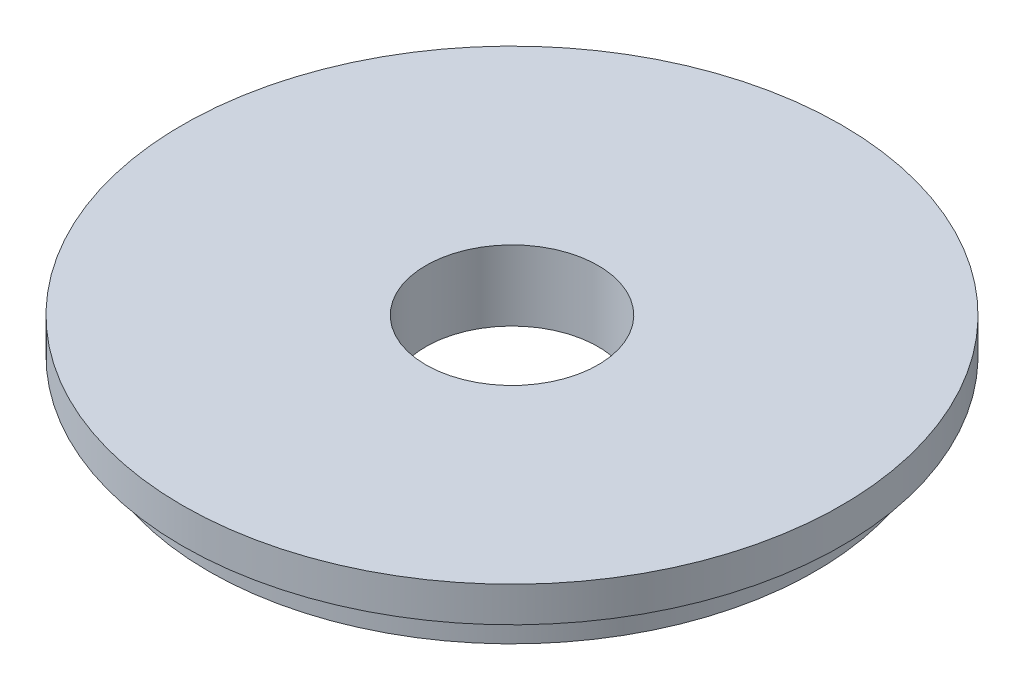
ISO-10303-21;
HEADER;
FILE_DESCRIPTION(('STEP AP214'),'2;1');
FILE_NAME('part.step','',(''),(''),'','','');
FILE_SCHEMA(('AUTOMOTIVE_DESIGN { 1 0 10303 214 1 1 1 1 }'));
ENDSEC;
DATA;
#1=APPLICATION_CONTEXT('core data for automotive mechanical design processes');
#2=APPLICATION_PROTOCOL_DEFINITION('international standard','automotive_design',2000,#1);
#3=PRODUCT_CONTEXT('',#1,'mechanical');
#4=PRODUCT('Part','Part','',(#3));
#5=PRODUCT_RELATED_PRODUCT_CATEGORY('part','',(#4));
#6=PRODUCT_DEFINITION_FORMATION('','',#4);
#7=PRODUCT_DEFINITION_CONTEXT('part definition',#1,'design');
#8=PRODUCT_DEFINITION('design','',#6,#7);
#9=PRODUCT_DEFINITION_SHAPE('','',#8);
#10=(LENGTH_UNIT() NAMED_UNIT(*) SI_UNIT(.MILLI.,.METRE.));
#11=(NAMED_UNIT(*) PLANE_ANGLE_UNIT() SI_UNIT($,.RADIAN.));
#12=(NAMED_UNIT(*) SI_UNIT($,.STERADIAN.) SOLID_ANGLE_UNIT());
#13=UNCERTAINTY_MEASURE_WITH_UNIT(LENGTH_MEASURE(1.E-05),#10,'distance_accuracy_value','');
#14=(GEOMETRIC_REPRESENTATION_CONTEXT(3) GLOBAL_UNCERTAINTY_ASSIGNED_CONTEXT((#13)) GLOBAL_UNIT_ASSIGNED_CONTEXT((#10,
#11,#12)) REPRESENTATION_CONTEXT('',''));
#15=CARTESIAN_POINT('',(0.,0.,0.));
#16=DIRECTION('',(0.,0.,1.));
#17=DIRECTION('',(1.,0.,0.));
#18=AXIS2_PLACEMENT_3D('',#15,#16,#17);
#19=CARTESIAN_POINT('',(0.,0.,-2.4892));
#20=DIRECTION('',(0.,-1.,0.));
#21=DIRECTION('',(0.,0.,-1.));
#22=AXIS2_PLACEMENT_3D('',#19,#20,#21);
#23=PLANE('',#22);
#24=CARTESIAN_POINT('',(0.,0.,0.));
#25=DIRECTION('',(0.,1.,0.));
#26=DIRECTION('',(0.,0.,1.));
#27=AXIS2_PLACEMENT_3D('',#24,#25,#26);
#28=CIRCLE('',#27,2.4892);
#29=CARTESIAN_POINT('',(0.,0.,2.4892));
#30=VERTEX_POINT('',#29);
#31=EDGE_CURVE('E55',#30,#30,#28,.T.);
#32=ORIENTED_EDGE('',*,*,#31,.F.);
#33=EDGE_LOOP('',(#32));
#34=FACE_BOUND('',#33,.T.);
#35=CARTESIAN_POINT('',(0.,0.,0.));
#36=DIRECTION('',(0.,1.,0.));
#37=DIRECTION('',(0.,0.,1.));
#38=AXIS2_PLACEMENT_3D('',#35,#36,#37);
#39=CIRCLE('',#38,9.525);
#40=CARTESIAN_POINT('',(0.,0.,9.525));
#41=VERTEX_POINT('',#40);
#42=EDGE_CURVE('E10',#41,#41,#39,.T.);
#43=ORIENTED_EDGE('',*,*,#42,.T.);
#44=EDGE_LOOP('',(#43));
#45=FACE_BOUND('',#44,.T.);
#46=ADVANCED_FACE('F33',(#34,#45),#23,.F.);
#47=CARTESIAN_POINT('',(0.,6.62192755465813,0.));
#48=DIRECTION('',(0.,1.,0.));
#49=DIRECTION('',(0.,0.,1.));
#50=AXIS2_PLACEMENT_3D('',#47,#48,#49);
#51=CYLINDRICAL_SURFACE('',#50,9.525);
#52=ORIENTED_EDGE('',*,*,#42,.F.);
#53=EDGE_LOOP('',(#52));
#54=FACE_BOUND('',#53,.T.);
#55=CARTESIAN_POINT('',(0.,-1.016,0.));
#56=DIRECTION('',(0.,1.,0.));
#57=DIRECTION('',(0.,0.,1.));
#58=AXIS2_PLACEMENT_3D('',#55,#56,#57);
#59=CIRCLE('',#58,9.525);
#60=CARTESIAN_POINT('',(0.,-1.016,9.525));
#61=VERTEX_POINT('',#60);
#62=EDGE_CURVE('E39',#61,#61,#59,.T.);
#63=ORIENTED_EDGE('',*,*,#62,.T.);
#64=EDGE_LOOP('',(#63));
#65=FACE_BOUND('',#64,.T.);
#66=ADVANCED_FACE('F62',(#54,#65),#51,.T.);
#67=CARTESIAN_POINT('',(0.,-1.016,-9.525));
#68=DIRECTION('',(0.,1.,0.));
#69=DIRECTION('',(0.,0.,1.));
#70=AXIS2_PLACEMENT_3D('',#67,#68,#69);
#71=PLANE('',#70);
#72=ORIENTED_EDGE('',*,*,#62,.F.);
#73=EDGE_LOOP('',(#72));
#74=FACE_BOUND('',#73,.T.);
#75=CARTESIAN_POINT('',(0.,-1.016,0.));
#76=DIRECTION('',(0.,1.,0.));
#77=DIRECTION('',(0.,0.,1.));
#78=AXIS2_PLACEMENT_3D('',#75,#76,#77);
#79=CIRCLE('',#78,8.763);
#80=CARTESIAN_POINT('',(0.,-1.016,8.763));
#81=VERTEX_POINT('',#80);
#82=EDGE_CURVE('E43',#81,#81,#79,.T.);
#83=ORIENTED_EDGE('',*,*,#82,.T.);
#84=EDGE_LOOP('',(#83));
#85=FACE_BOUND('',#84,.T.);
#86=ADVANCED_FACE('F66',(#74,#85),#71,.F.);
#87=CARTESIAN_POINT('',(0.,6.62192755465813,0.));
#88=DIRECTION('',(0.,1.,0.));
#89=DIRECTION('',(0.,0.,1.));
#90=AXIS2_PLACEMENT_3D('',#87,#88,#89);
#91=CYLINDRICAL_SURFACE('',#90,8.763);
#92=ORIENTED_EDGE('',*,*,#82,.F.);
#93=EDGE_LOOP('',(#92));
#94=FACE_BOUND('',#93,.T.);
#95=CARTESIAN_POINT('',(0.,-2.032,0.));
#96=DIRECTION('',(0.,1.,0.));
#97=DIRECTION('',(0.,0.,1.));
#98=AXIS2_PLACEMENT_3D('',#95,#96,#97);
#99=CIRCLE('',#98,8.763);
#100=CARTESIAN_POINT('',(0.,-2.032,8.763));
#101=VERTEX_POINT('',#100);
#102=EDGE_CURVE('E47',#101,#101,#99,.T.);
#103=ORIENTED_EDGE('',*,*,#102,.T.);
#104=EDGE_LOOP('',(#103));
#105=FACE_BOUND('',#104,.T.);
#106=ADVANCED_FACE('F71',(#94,#105),#91,.T.);
#107=CARTESIAN_POINT('',(0.,-2.032,-8.763));
#108=DIRECTION('',(0.,1.,0.));
#109=DIRECTION('',(0.,0.,1.));
#110=AXIS2_PLACEMENT_3D('',#107,#108,#109);
#111=PLANE('',#110);
#112=ORIENTED_EDGE('',*,*,#102,.F.);
#113=EDGE_LOOP('',(#112));
#114=FACE_BOUND('',#113,.T.);
#115=CARTESIAN_POINT('',(0.,-2.032,0.));
#116=DIRECTION('',(0.,1.,0.));
#117=DIRECTION('',(0.,0.,1.));
#118=AXIS2_PLACEMENT_3D('',#115,#116,#117);
#119=CIRCLE('',#118,2.4892);
#120=CARTESIAN_POINT('',(0.,-2.032,2.4892));
#121=VERTEX_POINT('',#120);
#122=EDGE_CURVE('E52',#121,#121,#119,.T.);
#123=ORIENTED_EDGE('',*,*,#122,.T.);
#124=EDGE_LOOP('',(#123));
#125=FACE_BOUND('',#124,.T.);
#126=ADVANCED_FACE('F77',(#114,#125),#111,.F.);
#127=CARTESIAN_POINT('',(0.,6.62192755465813,0.));
#128=DIRECTION('',(0.,1.,0.));
#129=DIRECTION('',(0.,0.,1.));
#130=AXIS2_PLACEMENT_3D('',#127,#128,#129);
#131=CYLINDRICAL_SURFACE('',#130,2.4892);
#132=ORIENTED_EDGE('',*,*,#122,.F.);
#133=EDGE_LOOP('',(#132));
#134=FACE_BOUND('',#133,.T.);
#135=ORIENTED_EDGE('',*,*,#31,.T.);
#136=EDGE_LOOP('',(#135));
#137=FACE_BOUND('',#136,.T.);
#138=ADVANCED_FACE('F59',(#134,#137),#131,.F.);
#139=CLOSED_SHELL('',(#46,#66,#86,#106,#126,#138));
#140=MANIFOLD_SOLID_BREP('B2',#139);
#141=ADVANCED_BREP_SHAPE_REPRESENTATION('',(#18,#140),#14);
#142=SHAPE_DEFINITION_REPRESENTATION(#9,#141);
ENDSEC;
END-ISO-10303-21;
